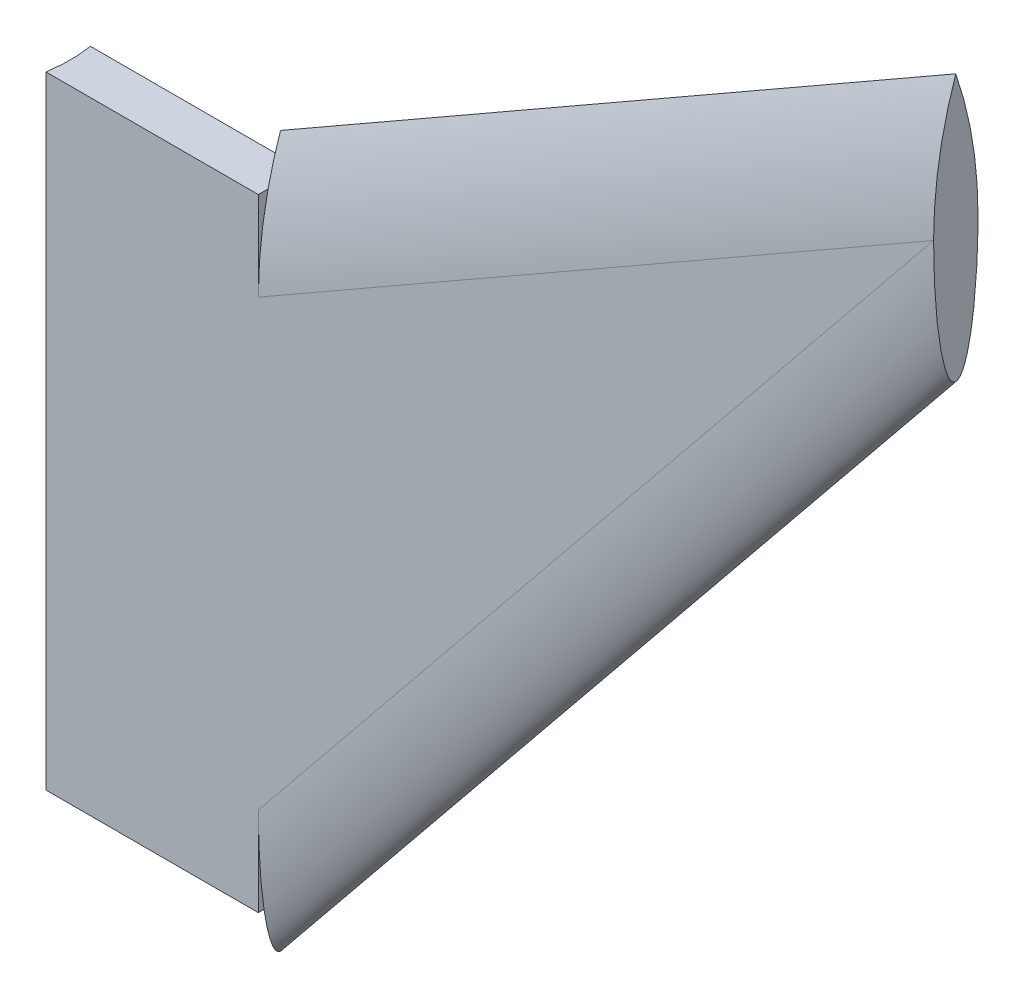
ISO-10303-21;
HEADER;
FILE_DESCRIPTION(('STEP AP214'),'2;1');
FILE_NAME('part.step','',(''),(''),'','','');
FILE_SCHEMA(('AUTOMOTIVE_DESIGN { 1 0 10303 214 1 1 1 1 }'));
ENDSEC;
DATA;
#1=APPLICATION_CONTEXT('core data for automotive mechanical design processes');
#2=APPLICATION_PROTOCOL_DEFINITION('international standard','automotive_design',2000,#1);
#3=PRODUCT_CONTEXT('',#1,'mechanical');
#4=PRODUCT('Part','Part','',(#3));
#5=PRODUCT_RELATED_PRODUCT_CATEGORY('part','',(#4));
#6=PRODUCT_DEFINITION_FORMATION('','',#4);
#7=PRODUCT_DEFINITION_CONTEXT('part definition',#1,'design');
#8=PRODUCT_DEFINITION('design','',#6,#7);
#9=PRODUCT_DEFINITION_SHAPE('','',#8);
#10=(LENGTH_UNIT() NAMED_UNIT(*) SI_UNIT(.MILLI.,.METRE.));
#11=(NAMED_UNIT(*) PLANE_ANGLE_UNIT() SI_UNIT($,.RADIAN.));
#12=(NAMED_UNIT(*) SI_UNIT($,.STERADIAN.) SOLID_ANGLE_UNIT());
#13=UNCERTAINTY_MEASURE_WITH_UNIT(LENGTH_MEASURE(1.E-05),#10,'distance_accuracy_value','');
#14=(GEOMETRIC_REPRESENTATION_CONTEXT(3) GLOBAL_UNCERTAINTY_ASSIGNED_CONTEXT((#13)) GLOBAL_UNIT_ASSIGNED_CONTEXT((#10,
#11,#12)) REPRESENTATION_CONTEXT('',''));
#15=CARTESIAN_POINT('',(0.,0.,0.));
#16=DIRECTION('',(0.,0.,1.));
#17=DIRECTION('',(1.,0.,0.));
#18=AXIS2_PLACEMENT_3D('',#15,#16,#17);
#19=CARTESIAN_POINT('',(101.,118.517979034708,5.));
#20=DIRECTION('',(-1.,0.,0.));
#21=DIRECTION('',(0.,-1.,0.));
#22=AXIS2_PLACEMENT_3D('',#19,#20,#21);
#23=PLANE('',#22);
#24=CARTESIAN_POINT('',(101.,103.517979034709,46.25));
#25=DIRECTION('',(1.,0.,0.));
#26=DIRECTION('',(0.,0.,-1.));
#27=AXIS2_PLACEMENT_3D('',#24,#25,#26);
#28=CIRCLE('',#27,46.25);
#29=CARTESIAN_POINT('',(101.,103.517979034708,0.));
#30=VERTEX_POINT('',#29);
#31=CARTESIAN_POINT('',(101.,118.517979034708,2.5));
#32=VERTEX_POINT('',#31);
#33=EDGE_CURVE('E154',#30,#32,#28,.T.);
#34=ORIENTED_EDGE('',*,*,#33,.T.);
#35=CARTESIAN_POINT('',(101.,103.517979034709,-41.2500000000003));
#36=DIRECTION('',(1.,0.,0.));
#37=DIRECTION('',(0.,0.,-1.));
#38=AXIS2_PLACEMENT_3D('',#35,#36,#37);
#39=CIRCLE('',#38,46.2500000000001);
#40=CARTESIAN_POINT('',(101.,103.517979034708,5.));
#41=VERTEX_POINT('',#40);
#42=EDGE_CURVE('E249',#41,#32,#39,.F.);
#43=ORIENTED_EDGE('',*,*,#42,.F.);
#44=CARTESIAN_POINT('',(101.,103.517979034708,2.5));
#45=DIRECTION('',(1.,0.,0.));
#46=DIRECTION('',(0.,-1.,0.));
#47=AXIS2_PLACEMENT_3D('',#44,#45,#46);
#48=ELLIPSE('',#47,15.,2.5);
#49=EDGE_CURVE('E187',#41,#30,#48,.T.);
#50=ORIENTED_EDGE('',*,*,#49,.T.);
#51=EDGE_LOOP('',(#34,#43,#50));
#52=FACE_BOUND('',#51,.T.);
#53=ADVANCED_FACE('F57',(#52),#23,.F.);
#54=CARTESIAN_POINT('',(25.,70.,5.));
#55=DIRECTION('',(1.,0.,0.));
#56=DIRECTION('',(0.,1.,0.));
#57=AXIS2_PLACEMENT_3D('',#54,#55,#56);
#58=PLANE('',#57);
#59=CARTESIAN_POINT('',(24.9999999999998,75.,2.5));
#60=CARTESIAN_POINT('',(24.9999999999998,74.5958135468942,2.36142006780214));
#61=CARTESIAN_POINT('',(24.9999999999998,74.1897057927937,2.22844436325049));
#62=CARTESIAN_POINT('',(24.9999999999998,73.3754995083999,1.9742767450913));
#63=CARTESIAN_POINT('',(24.9999999999998,72.9674142565219,1.85304229395882));
#64=CARTESIAN_POINT('',(24.9999999999998,72.1492854164186,1.6222341784096));
#65=CARTESIAN_POINT('',(24.9999999999999,71.7392514201679,1.51262651320022));
#66=CARTESIAN_POINT('',(24.9999999999999,70.9172509844841,1.30497331968858));
#67=CARTESIAN_POINT('',(24.9999999999999,70.5052909984862,1.20690224469508));
#68=CARTESIAN_POINT('',(24.9999999999999,69.6794572334645,1.02225008441754));
#69=CARTESIAN_POINT('',(24.9999999999999,69.2655872843,0.935651870302538));
#70=CARTESIAN_POINT('',(24.9999999999999,68.435945380078,0.773898513911818));
#71=CARTESIAN_POINT('',(24.9999999999999,68.0201751191739,0.698734682146799));
#72=CARTESIAN_POINT('',(24.9999999999999,67.1867312065716,0.559827363379909));
#73=CARTESIAN_POINT('',(24.9999999999999,66.7690575548736,0.496083876378038));
#74=CARTESIAN_POINT('',(24.9999999999999,65.9318006109698,0.380020758077656));
#75=CARTESIAN_POINT('',(24.9999999999999,65.5122161031286,0.327709896021407));
#76=CARTESIAN_POINT('',(24.9999999999999,64.6711348139635,0.234542880605562));
#77=CARTESIAN_POINT('',(24.9999999999999,64.2496361001829,0.193704172310695));
#78=CARTESIAN_POINT('',(24.9999999999999,63.4047211387974,0.123538133037283));
#79=CARTESIAN_POINT('',(24.9999999999999,62.9813027103802,0.0942370608539308));
#80=CARTESIAN_POINT('',(24.9999999999999,62.1325403646945,0.0472299788352955));
#81=CARTESIAN_POINT('',(24.9999999999999,61.7071944936317,0.0295592428226022));
#82=CARTESIAN_POINT('',(24.9999999999999,60.8545666187261,0.005921167723736));
#83=CARTESIAN_POINT('',(24.9999999999999,60.4272833795923,-1.62665042894894E-06));
#84=CARTESIAN_POINT('',(24.9999999999999,60.,0.));
#85=B_SPLINE_CURVE_WITH_KNOTS('',3,(#59,#60,#61,#62,#63,#64,#65,#66,#67,#68,#69,#70,#71,#72,#73,
#74,#75,#76,#77,#78,#79,#80,#81,#82,#83,#84),.UNSPECIFIED.,.F.,.F.,(4,2,2,2,2,2,2,2,2,2,2,2,4),
(0.,1.28180880434696,2.55878487996336,3.83191723178794,5.10217505462903,6.37051449783669,
7.63788520674629,8.90525591565599,10.1735953588638,11.4438531817043,12.7169855335304,
13.9939616091477,15.275770413483),.UNSPECIFIED.);
#86=CARTESIAN_POINT('',(24.9999999999998,75.,2.5));
#87=VERTEX_POINT('',#86);
#88=CARTESIAN_POINT('',(24.9999999999999,70.,1.09402032952891));
#89=VERTEX_POINT('',#88);
#90=EDGE_CURVE('E320',#87,#89,#85,.T.);
#91=ORIENTED_EDGE('',*,*,#90,.T.);
#92=DIRECTION('',(0.,0.,-1.));
#93=VECTOR('',#92,1.);
#94=CARTESIAN_POINT('',(25.,70.,5.));
#95=LINE('',#94,#93);
#96=CARTESIAN_POINT('',(24.9999999999999,70.,3.90597967047113));
#97=VERTEX_POINT('',#96);
#98=EDGE_CURVE('E171',#97,#89,#95,.T.);
#99=ORIENTED_EDGE('',*,*,#98,.F.);
#100=CARTESIAN_POINT('',(24.9999999999998,75.,2.5000000000001));
#101=CARTESIAN_POINT('',(24.9999999999998,74.5958135468942,2.63857993219796));
#102=CARTESIAN_POINT('',(24.9999999999998,74.1897057927937,2.7715556367496));
#103=CARTESIAN_POINT('',(24.9999999999998,73.3754995083999,3.02572325490877));
#104=CARTESIAN_POINT('',(24.9999999999998,72.967414256522,3.14695770604125));
#105=CARTESIAN_POINT('',(24.9999999999998,72.1492854164186,3.37776582159045));
#106=CARTESIAN_POINT('',(24.9999999999999,71.739251420168,3.48737348679984));
#107=CARTESIAN_POINT('',(24.9999999999999,70.9172509844841,3.69502668031146));
#108=CARTESIAN_POINT('',(24.9999999999999,70.5052909984863,3.79309775530496));
#109=CARTESIAN_POINT('',(24.9999999999999,69.6794572334646,3.97774991558248));
#110=CARTESIAN_POINT('',(24.9999999999999,69.2655872843,4.06434812969748));
#111=CARTESIAN_POINT('',(24.9999999999999,68.435945380078,4.22610148608819));
#112=CARTESIAN_POINT('',(24.9999999999999,68.0201751191739,4.30126531785321));
#113=CARTESIAN_POINT('',(24.9999999999999,67.1867312065717,4.44017263662009));
#114=CARTESIAN_POINT('',(24.9999999999999,66.7690575548736,4.50391612362194));
#115=CARTESIAN_POINT('',(24.9999999999999,65.9318006109698,4.61997924192231));
#116=CARTESIAN_POINT('',(24.9999999999999,65.5122161031286,4.67229010397856));
#117=CARTESIAN_POINT('',(24.9999999999999,64.6711348139635,4.7654571193944));
#118=CARTESIAN_POINT('',(24.9999999999999,64.2496361001829,4.80629582768926));
#119=CARTESIAN_POINT('',(24.9999999999999,63.4047211387974,4.87646186696266));
#120=CARTESIAN_POINT('',(24.9999999999999,62.9813027103802,4.905762939146));
#121=CARTESIAN_POINT('',(24.9999999999999,62.1325403646945,4.95277002116463));
#122=CARTESIAN_POINT('',(24.9999999999999,61.7071944936317,4.97044075717731));
#123=CARTESIAN_POINT('',(24.9999999999999,60.8545666187261,4.99407883227616));
#124=CARTESIAN_POINT('',(24.9999999999999,60.4272833795923,5.00000162665032));
#125=CARTESIAN_POINT('',(24.9999999999999,60.,4.99999999999989));
#126=B_SPLINE_CURVE_WITH_KNOTS('',3,(#100,#101,#102,#103,#104,#105,#106,#107,#108,#109,#110,
#111,#112,#113,#114,#115,#116,#117,#118,#119,#120,#121,#122,#123,#124,#125),.UNSPECIFIED.,.F.,
.F.,(4,2,2,2,2,2,2,2,2,2,2,2,4),(0.,1.28180880434696,2.55878487996336,3.83191723178793,
5.10217505462904,6.37051449783671,7.63788520674631,8.90525591565602,10.1735953588638,
11.4438531817043,12.7169855335304,13.9939616091478,15.275770413483),.UNSPECIFIED.);
#127=EDGE_CURVE('E223',#87,#97,#126,.T.);
#128=ORIENTED_EDGE('',*,*,#127,.F.);
#129=EDGE_LOOP('',(#91,#99,#128));
#130=FACE_BOUND('',#129,.T.);
#131=ADVANCED_FACE('F280',(#130),#58,.F.);
#132=CARTESIAN_POINT('',(0.,0.,0.));
#133=DIRECTION('',(0.,0.,-1.));
#134=DIRECTION('',(-1.,0.,0.));
#135=AXIS2_PLACEMENT_3D('',#132,#133,#134);
#136=PLANE('',#135);
#137=DIRECTION('',(0.,1.,0.));
#138=VECTOR('',#137,1.);
#139=CARTESIAN_POINT('',(1.10222914111242,-5.25596022674048,0.));
#140=LINE('',#139,#138);
#141=CARTESIAN_POINT('',(1.10222914111242,70.,0.));
#142=VERTEX_POINT('',#141);
#143=CARTESIAN_POINT('',(1.10222914111242,0.,0.));
#144=VERTEX_POINT('',#143);
#145=EDGE_CURVE('E136',#142,#144,#140,.F.);
#146=ORIENTED_EDGE('',*,*,#145,.F.);
#147=DIRECTION('',(-1.,0.,0.));
#148=VECTOR('',#147,1.);
#149=CARTESIAN_POINT('',(0.,70.,0.));
#150=LINE('',#149,#148);
#151=CARTESIAN_POINT('',(24.9999999999999,70.,0.));
#152=VERTEX_POINT('',#151);
#153=EDGE_CURVE('E150',#152,#142,#150,.T.);
#154=ORIENTED_EDGE('',*,*,#153,.F.);
#155=DIRECTION('',(0.,-1.,0.));
#156=VECTOR('',#155,1.);
#157=CARTESIAN_POINT('',(25.0000000000001,-51.6499735481215,0.));
#158=LINE('',#157,#156);
#159=CARTESIAN_POINT('',(24.9999999999999,60.,0.));
#160=VERTEX_POINT('',#159);
#161=EDGE_CURVE('E312',#152,#160,#158,.T.);
#162=ORIENTED_EDGE('',*,*,#161,.T.);
#163=DIRECTION('',(0.867803029916963,0.496908342923459,0.));
#164=VECTOR('',#163,1.);
#165=CARTESIAN_POINT('',(10.7982471445544,51.868005486587,0.));
#166=LINE('',#165,#164);
#167=EDGE_CURVE('E311',#160,#30,#166,.T.);
#168=ORIENTED_EDGE('',*,*,#167,.T.);
#169=DIRECTION('',(0.63067580743129,0.776046407066543,0.));
#170=VECTOR('',#169,1.);
#171=CARTESIAN_POINT('',(12.6012328743665,-5.25667952777929,0.));
#172=LINE('',#171,#170);
#173=CARTESIAN_POINT('',(25.,10.,0.));
#174=VERTEX_POINT('',#173);
#175=EDGE_CURVE('E182',#174,#30,#172,.T.);
#176=ORIENTED_EDGE('',*,*,#175,.F.);
#177=DIRECTION('',(0.,-1.,0.));
#178=VECTOR('',#177,1.);
#179=CARTESIAN_POINT('',(25.0000000000002,-108.774658562488,0.));
#180=LINE('',#179,#178);
#181=CARTESIAN_POINT('',(25.,0.,0.));
#182=VERTEX_POINT('',#181);
#183=EDGE_CURVE('E186',#174,#182,#180,.T.);
#184=ORIENTED_EDGE('',*,*,#183,.T.);
#185=DIRECTION('',(1.,0.,0.));
#186=VECTOR('',#185,1.);
#187=CARTESIAN_POINT('',(25.,0.,0.));
#188=LINE('',#187,#186);
#189=EDGE_CURVE('E152',#144,#182,#188,.T.);
#190=ORIENTED_EDGE('',*,*,#189,.F.);
#191=EDGE_LOOP('',(#146,#154,#162,#168,#176,#184,#190));
#192=FACE_BOUND('',#191,.T.);
#193=ADVANCED_FACE('F148',(#192),#136,.T.);
#194=CARTESIAN_POINT('',(0.,0.,5.));
#195=DIRECTION('',(0.,0.,-1.));
#196=DIRECTION('',(-1.,0.,0.));
#197=AXIS2_PLACEMENT_3D('',#194,#195,#196);
#198=PLANE('',#197);
#199=DIRECTION('',(-1.,0.,0.));
#200=VECTOR('',#199,1.);
#201=CARTESIAN_POINT('',(0.,70.,5.));
#202=LINE('',#201,#200);
#203=CARTESIAN_POINT('',(25.,70.,5.));
#204=VERTEX_POINT('',#203);
#205=CARTESIAN_POINT('',(1.10222914111242,70.,5.));
#206=VERTEX_POINT('',#205);
#207=EDGE_CURVE('E165',#204,#206,#202,.T.);
#208=ORIENTED_EDGE('',*,*,#207,.T.);
#209=DIRECTION('',(0.,1.,0.));
#210=VECTOR('',#209,1.);
#211=CARTESIAN_POINT('',(1.10222914111242,-5.25596022674048,5.));
#212=LINE('',#211,#210);
#213=CARTESIAN_POINT('',(1.10222914111242,0.,5.));
#214=VERTEX_POINT('',#213);
#215=EDGE_CURVE('E73',#206,#214,#212,.F.);
#216=ORIENTED_EDGE('',*,*,#215,.T.);
#217=DIRECTION('',(1.,0.,0.));
#218=VECTOR('',#217,1.);
#219=CARTESIAN_POINT('',(25.,0.,5.));
#220=LINE('',#219,#218);
#221=CARTESIAN_POINT('',(25.,0.,5.));
#222=VERTEX_POINT('',#221);
#223=EDGE_CURVE('E161',#214,#222,#220,.T.);
#224=ORIENTED_EDGE('',*,*,#223,.T.);
#225=DIRECTION('',(0.,1.,0.));
#226=VECTOR('',#225,1.);
#227=CARTESIAN_POINT('',(25.0000000000002,-108.774658562488,5.));
#228=LINE('',#227,#226);
#229=CARTESIAN_POINT('',(25.,10.,5.));
#230=VERTEX_POINT('',#229);
#231=EDGE_CURVE('E191',#222,#230,#228,.T.);
#232=ORIENTED_EDGE('',*,*,#231,.T.);
#233=DIRECTION('',(0.63067580743129,0.776046407066543,0.));
#234=VECTOR('',#233,1.);
#235=CARTESIAN_POINT('',(12.6012328743665,-5.25667952777929,5.));
#236=LINE('',#235,#234);
#237=EDGE_CURVE('E222',#230,#41,#236,.T.);
#238=ORIENTED_EDGE('',*,*,#237,.T.);
#239=DIRECTION('',(0.867803029916963,0.496908342923459,0.));
#240=VECTOR('',#239,1.);
#241=CARTESIAN_POINT('',(10.7982471445543,51.868005486587,5.));
#242=LINE('',#241,#240);
#243=CARTESIAN_POINT('',(24.9999999999999,60.,4.99999999999989));
#244=VERTEX_POINT('',#243);
#245=EDGE_CURVE('E253',#244,#41,#242,.T.);
#246=ORIENTED_EDGE('',*,*,#245,.F.);
#247=DIRECTION('',(0.,1.,0.));
#248=VECTOR('',#247,1.);
#249=CARTESIAN_POINT('',(25.0000000000001,-51.6499735481215,5.));
#250=LINE('',#249,#248);
#251=EDGE_CURVE('E247',#244,#204,#250,.T.);
#252=ORIENTED_EDGE('',*,*,#251,.T.);
#253=EDGE_LOOP('',(#208,#216,#224,#232,#238,#246,#252));
#254=FACE_BOUND('',#253,.T.);
#255=ADVANCED_FACE('F210',(#254),#198,.F.);
#256=CARTESIAN_POINT('',(25.,-5.,5.));
#257=DIRECTION('',(1.,0.,0.));
#258=DIRECTION('',(0.,1.,0.));
#259=AXIS2_PLACEMENT_3D('',#256,#257,#258);
#260=PLANE('',#259);
#261=CARTESIAN_POINT('',(25.,10.0000000000001,0.));
#262=CARTESIAN_POINT('',(25.,9.67532275035934,7.56133223554671E-06));
#263=CARTESIAN_POINT('',(25.,9.35064536499602,0.00175708495777899));
#264=CARTESIAN_POINT('',(25.,8.70132513673443,0.00879521380321717));
#265=CARTESIAN_POINT('',(25.,8.37668229430042,0.0140838617419464));
#266=CARTESIAN_POINT('',(25.,7.72735696655638,0.0282579491785811));
#267=CARTESIAN_POINT('',(25.,7.40267450903772,0.0371446826339007));
#268=CARTESIAN_POINT('',(25.,6.75343686188827,0.0586367090531587));
#269=CARTESIAN_POINT('',(25.,6.4288816717831,0.0712419880221396));
#270=CARTESIAN_POINT('',(25.,5.45543887862898,0.114859287202401));
#271=CARTESIAN_POINT('',(25.,4.80679070223077,0.151672420879383));
#272=CARTESIAN_POINT('',(25.,3.83481625123288,0.220176302364027));
#273=CARTESIAN_POINT('',(25.,3.51101131057275,0.245222975900726));
#274=CARTESIAN_POINT('',(25.,2.86381877306203,0.300207757168315));
#275=CARTESIAN_POINT('',(25.,2.54043116783826,0.330145765174599));
#276=CARTESIAN_POINT('',(25.,1.89426512340139,0.395507889620493));
#277=CARTESIAN_POINT('',(25.,1.57148658575406,0.430931025814008));
#278=CARTESIAN_POINT('',(25.,0.926667746970848,0.508125603197061));
#279=CARTESIAN_POINT('',(25.,0.604627484944687,0.549897373158213));
#280=CARTESIAN_POINT('',(25.,-0.0384997840056257,0.641032282782652));
#281=CARTESIAN_POINT('',(25.,-0.359586461907177,0.690397788580127));
#282=CARTESIAN_POINT('',(25.,-0.839994182229534,0.7715921884241));
#283=CARTESIAN_POINT('',(25.,-0.999920871315269,0.799846912813791));
#284=CARTESIAN_POINT('',(25.,-1.31926281202815,0.859103519460821));
#285=CARTESIAN_POINT('',(25.,-1.47867807697331,0.890105329569545));
#286=CARTESIAN_POINT('',(25.,-1.83705712759722,0.96355366601201));
#287=CARTESIAN_POINT('',(25.,-2.03583551366993,1.00691263368543));
#288=CARTESIAN_POINT('',(25.,-2.43195778587836,1.09995809546825));
#289=CARTESIAN_POINT('',(25.,-2.62930150142539,1.14964532943745));
#290=CARTESIAN_POINT('',(25.,-2.9602714208982,1.24060720104233));
#291=CARTESIAN_POINT('',(25.,-3.09450943635846,1.27964785434004));
#292=CARTESIAN_POINT('',(25.,-3.36134043501196,1.36281101318828));
#293=CARTESIAN_POINT('',(25.,-3.49393439722164,1.40693031583923));
#294=CARTESIAN_POINT('',(25.,-3.71628217995382,1.48743108611502));
#295=CARTESIAN_POINT('',(25.,-3.8066811093193,1.52202487044376));
#296=CARTESIAN_POINT('',(25.,-3.98591235016378,1.59551404646567));
#297=CARTESIAN_POINT('',(25.,-4.07474205461968,1.63441593518394));
#298=CARTESIAN_POINT('',(25.,-4.20674341689537,1.6974602939974));
#299=CARTESIAN_POINT('',(25.,-4.25092950683264,1.71947760958914));
#300=CARTESIAN_POINT('',(25.,-4.33836113223407,1.76529907784134));
#301=CARTESIAN_POINT('',(25.,-4.38160686598438,1.7891028489987));
#302=CARTESIAN_POINT('',(25.,-4.46672973029745,1.83881969402548));
#303=CARTESIAN_POINT('',(25.,-4.5086100807554,1.86472721268972));
#304=CARTESIAN_POINT('',(25.,-4.59058190265999,1.9192109991219));
#305=CARTESIAN_POINT('',(25.,-4.63067465402466,1.94778531060749));
#306=CARTESIAN_POINT('',(25.,-4.70168335859472,2.00322359669874));
#307=CARTESIAN_POINT('',(25.,-4.73300568035986,2.02956155957545));
#308=CARTESIAN_POINT('',(25.,-4.79307871453009,2.08521498286559));
#309=CARTESIAN_POINT('',(25.,-4.82182314227616,2.11453736670229));
#310=CARTESIAN_POINT('',(25.,-4.87569190823456,2.17722511856491));
#311=CARTESIAN_POINT('',(25.,-4.90075269281422,2.21064648009142));
#312=CARTESIAN_POINT('',(25.,-4.94415241241109,2.28159027223693));
#313=CARTESIAN_POINT('',(25.,-4.96252830298809,2.31908861990152));
#314=CARTESIAN_POINT('',(25.,-4.98365167506094,2.38109629548705));
#315=CARTESIAN_POINT('',(25.,-4.98972134299569,2.40446694324211));
#316=CARTESIAN_POINT('',(25.,-4.99789587786701,2.45188867690431));
#317=CARTESIAN_POINT('',(25.,-5.00000440540761,2.47593911371047));
#318=CARTESIAN_POINT('',(25.,-4.99999451308198,2.52996773886832));
#319=CARTESIAN_POINT('',(25.,-4.99671131692346,2.55995168760653));
#320=CARTESIAN_POINT('',(25.,-4.98414295822843,2.61865234481266));
#321=CARTESIAN_POINT('',(25.,-4.97484113691508,2.64736529894001));
#322=CARTESIAN_POINT('',(25.,-4.94886676045699,2.70905123917844));
#323=CARTESIAN_POINT('',(25.,-4.93099871513826,2.74150709556974));
#324=CARTESIAN_POINT('',(25.,-4.89044101887684,2.80320824733061));
#325=CARTESIAN_POINT('',(25.,-4.86774163800433,2.83244688046202));
#326=CARTESIAN_POINT('',(25.,-4.82056090951797,2.88644107771681));
#327=CARTESIAN_POINT('',(25.,-4.79626111585993,2.91135874969152));
#328=CARTESIAN_POINT('',(25.,-4.74564642349131,2.95907694809897));
#329=CARTESIAN_POINT('',(25.,-4.71932959235663,2.98187539675582));
#330=CARTESIAN_POINT('',(25.,-4.66518645502088,3.02573752450521));
#331=CARTESIAN_POINT('',(25.,-4.63735633035506,3.04679644206807));
#332=CARTESIAN_POINT('',(25.,-4.58063115741204,3.08738470201685));
#333=CARTESIAN_POINT('',(25.,-4.55173660929604,3.10691474965394));
#334=CARTESIAN_POINT('',(25.,-4.45344664980039,3.1702905443867));
#335=CARTESIAN_POINT('',(25.,-4.38219234062586,3.21125012979468));
#336=CARTESIAN_POINT('',(25.,-4.2369586853241,3.28823304590489));
#337=CARTESIAN_POINT('',(25.,-4.1629739607818,3.32424589284139));
#338=CARTESIAN_POINT('',(25.,-4.01321478537931,3.39252099498327));
#339=CARTESIAN_POINT('',(25.,-3.93743859513179,3.42477940848475));
#340=CARTESIAN_POINT('',(25.,-3.78439894400186,3.48644273828844));
#341=CARTESIAN_POINT('',(25.,-3.70713078916872,3.5158358746132));
#342=CARTESIAN_POINT('',(25.,-3.55182020749583,3.57215618767203));
#343=CARTESIAN_POINT('',(25.,-3.47377892469091,3.59908653737109));
#344=CARTESIAN_POINT('',(25.,-3.31705759844936,3.65092011964819));
#345=CARTESIAN_POINT('',(25.,-3.2383777642578,3.67582398894862));
#346=CARTESIAN_POINT('',(25.,-3.01832939261564,3.74286704191742));
#347=CARTESIAN_POINT('',(25.,-2.87639024039567,3.783133686798));
#348=CARTESIAN_POINT('',(25.,-2.59134112360011,3.85943797190763));
#349=CARTESIAN_POINT('',(25.,-2.44823075473301,3.89547407971653));
#350=CARTESIAN_POINT('',(25.,-2.16167586786272,3.9639766092781));
#351=CARTESIAN_POINT('',(25.,-2.01823413571379,3.99645473966051));
#352=CARTESIAN_POINT('',(25.,-1.73072748186224,4.05853581348177));
#353=CARTESIAN_POINT('',(25.,-1.58666253155399,4.08813862344933));
#354=CARTESIAN_POINT('',(25.,-1.15386717451548,4.17324699095801));
#355=CARTESIAN_POINT('',(25.,-0.864413430753736,4.22508100206858));
#356=CARTESIAN_POINT('',(25.,-0.284008926264064,4.32121687381062));
#357=CARTESIAN_POINT('',(25.,0.0069429683010837,4.36551174852651));
#358=CARTESIAN_POINT('',(25.,0.589691264996475,4.44787620611771));
#359=CARTESIAN_POINT('',(25.,0.881487579150644,4.48594641531899));
#360=CARTESIAN_POINT('',(25.,1.46572587284512,4.55680817049463));
#361=CARTESIAN_POINT('',(25.,1.75816787607839,4.58959951938967));
#362=CARTESIAN_POINT('',(25.,2.34346275220135,4.65055853367153));
#363=CARTESIAN_POINT('',(25.,2.63631551489506,4.6787272626783));
#364=CARTESIAN_POINT('',(25.,3.22239044666584,4.73093322725807));
#365=CARTESIAN_POINT('',(25.,3.51561262130694,4.7549703998343));
#366=CARTESIAN_POINT('',(25.,4.32349964848445,4.81598960541001));
#367=CARTESIAN_POINT('',(25.,4.83846184282847,4.84906982516783));
#368=CARTESIAN_POINT('',(25.,5.86894353471173,4.90501521693859));
#369=CARTESIAN_POINT('',(25.,6.38446304888823,4.92788007505827));
#370=CARTESIAN_POINT('',(25.,7.41659972320971,4.96421439215558));
#371=CARTESIAN_POINT('',(25.,7.93321737703503,4.97766985975036));
#372=CARTESIAN_POINT('',(25.,8.70823127944996,4.99108773405887));
#373=CARTESIAN_POINT('',(25.,8.96657377012626,4.99443280575569));
#374=CARTESIAN_POINT('',(25.,9.48327704593899,4.99888783705212));
#375=CARTESIAN_POINT('',(25.,9.74163783100035,4.99999780534674));
#376=CARTESIAN_POINT('',(25.,10.,5.));
#377=B_SPLINE_CURVE_WITH_KNOTS('',3,(#261,#262,#263,#264,#265,#266,#267,#268,#269,#270,#271,
#272,#273,#274,#275,#276,#277,#278,#279,#280,#281,#282,#283,#284,#285,#286,#287,#288,#289,#290,
#291,#292,#293,#294,#295,#296,#297,#298,#299,#300,#301,#302,#303,#304,#305,#306,#307,#308,#309,
#310,#311,#312,#313,#314,#315,#316,#317,#318,#319,#320,#321,#322,#323,#324,#325,#326,#327,#328,
#329,#330,#331,#332,#333,#334,#335,#336,#337,#338,#339,#340,#341,#342,#343,#344,#345,#346,#347,
#348,#349,#350,#351,#352,#353,#354,#355,#356,#357,#358,#359,#360,#361,#362,#363,#364,#365,#366,
#367,#368,#369,#370,#371,#372,#373,#374,#375,#376),.UNSPECIFIED.,.F.,.F.,(4,2,2,2,2,2,2,2,2,2,2,
2,2,2,2,2,2,2,2,2,2,2,2,2,2,2,2,2,2,2,2,2,2,2,2,2,2,2,2,2,2,2,2,2,2,2,2,2,2,2,2,2,2,2,2,2,2,4),
(0.,0.974027079733696,1.94806591662778,2.92245535270449,3.89684112165791,5.84566260813312,
6.81995136736275,7.79422026525553,8.76831525227762,9.74246070117611,10.7169103014632,
11.2041014547082,11.6912798163048,12.3015620211395,12.9119156418166,13.3312469148683,
13.7503151666711,14.0406212830225,14.331371328779,14.4794434743774,14.6274840882013,
14.7751457585396,14.9226999474174,15.045337023162,15.1682653804141,15.2931137328291,
15.4172610133488,15.4894051869995,15.5614826572803,15.6512548619144,15.7412766135366,
15.8517804827909,15.9625090402868,16.0667693143335,16.1711307545336,16.2757689937183,
16.3803586764507,16.6265806144706,16.8733165815827,17.1203028406379,17.3682651206437,
17.6159032966578,17.8634633616033,18.3059888961714,18.7486742346152,19.189856004125,
19.6310582433492,20.5130846493787,21.3959239610847,22.2786743867403,23.1614577610843,
24.0440377298885,24.9266311548237,26.47457580642,28.022568019328,29.5728571674391,
30.3479414671659,31.1230227516467),.UNSPECIFIED.);
#378=CARTESIAN_POINT('',(25.,0.,0.636610018750189));
#379=VERTEX_POINT('',#378);
#380=CARTESIAN_POINT('',(25.,0.,4.36338998124981));
#381=VERTEX_POINT('',#380);
#382=EDGE_CURVE('E297',#379,#381,#377,.T.);
#383=ORIENTED_EDGE('',*,*,#382,.T.);
#384=DIRECTION('',(0.,0.,-1.));
#385=VECTOR('',#384,1.);
#386=CARTESIAN_POINT('',(25.,0.,5.));
#387=LINE('',#386,#385);
#388=EDGE_CURVE('E66',#381,#379,#387,.T.);
#389=ORIENTED_EDGE('',*,*,#388,.T.);
#390=EDGE_LOOP('',(#383,#389));
#391=FACE_BOUND('',#390,.T.);
#392=ADVANCED_FACE('F288',(#391),#260,.F.);
#393=CARTESIAN_POINT('',(25.,0.,5.));
#394=DIRECTION('',(0.,1.,0.));
#395=DIRECTION('',(-1.,0.,0.));
#396=AXIS2_PLACEMENT_3D('',#393,#394,#395);
#397=PLANE('',#396);
#398=ORIENTED_EDGE('',*,*,#223,.F.);
#399=CARTESIAN_POINT('',(-14.6,0.,2.5));
#400=DIRECTION('',(0.,1.,0.));
#401=DIRECTION('',(-1.,0.,0.));
#402=AXIS2_PLACEMENT_3D('',#399,#400,#401);
#403=CIRCLE('',#402,15.9);
#404=EDGE_CURVE('E143',#214,#144,#403,.T.);
#405=ORIENTED_EDGE('',*,*,#404,.T.);
#406=ORIENTED_EDGE('',*,*,#189,.T.);
#407=DIRECTION('',(0.,0.,-1.));
#408=VECTOR('',#407,1.);
#409=CARTESIAN_POINT('',(25.,0.,5.));
#410=LINE('',#409,#408);
#411=EDGE_CURVE('E167',#379,#182,#410,.T.);
#412=ORIENTED_EDGE('',*,*,#411,.F.);
#413=ORIENTED_EDGE('',*,*,#388,.F.);
#414=EDGE_CURVE('E12',#222,#381,#387,.T.);
#415=ORIENTED_EDGE('',*,*,#414,.F.);
#416=EDGE_LOOP('',(#398,#405,#406,#412,#413,#415));
#417=FACE_BOUND('',#416,.T.);
#418=ADVANCED_FACE('F59',(#417),#397,.F.);
#419=CARTESIAN_POINT('',(0.,70.,5.));
#420=DIRECTION('',(0.,-1.,0.));
#421=DIRECTION('',(0.,0.,-1.));
#422=AXIS2_PLACEMENT_3D('',#419,#420,#421);
#423=PLANE('',#422);
#424=ORIENTED_EDGE('',*,*,#153,.T.);
#425=CARTESIAN_POINT('',(-14.6,70.,2.5));
#426=DIRECTION('',(0.,1.,0.));
#427=DIRECTION('',(0.,0.,1.));
#428=AXIS2_PLACEMENT_3D('',#425,#426,#427);
#429=CIRCLE('',#428,15.9);
#430=EDGE_CURVE('E133',#206,#142,#429,.T.);
#431=ORIENTED_EDGE('',*,*,#430,.F.);
#432=ORIENTED_EDGE('',*,*,#207,.F.);
#433=EDGE_CURVE('E82',#204,#97,#95,.T.);
#434=ORIENTED_EDGE('',*,*,#433,.T.);
#435=ORIENTED_EDGE('',*,*,#98,.T.);
#436=DIRECTION('',(0.,0.,1.));
#437=VECTOR('',#436,1.);
#438=CARTESIAN_POINT('',(24.9999999999999,70.,5.));
#439=LINE('',#438,#437);
#440=EDGE_CURVE('E159',#152,#89,#439,.T.);
#441=ORIENTED_EDGE('',*,*,#440,.F.);
#442=EDGE_LOOP('',(#424,#431,#432,#434,#435,#441));
#443=FACE_BOUND('',#442,.T.);
#444=ADVANCED_FACE('F157',(#443),#423,.F.);
#445=CARTESIAN_POINT('',(25.,-5.,5.));
#446=DIRECTION('',(1.,0.,0.));
#447=DIRECTION('',(0.,1.,0.));
#448=AXIS2_PLACEMENT_3D('',#445,#446,#447);
#449=PLANE('',#448);
#450=ORIENTED_EDGE('',*,*,#411,.T.);
#451=ORIENTED_EDGE('',*,*,#183,.F.);
#452=EDGE_CURVE('E181',#174,#379,#377,.T.);
#453=ORIENTED_EDGE('',*,*,#452,.T.);
#454=EDGE_LOOP('',(#450,#451,#453));
#455=FACE_BOUND('',#454,.T.);
#456=ADVANCED_FACE('F206',(#455),#449,.T.);
#457=CARTESIAN_POINT('',(12.6012328743664,-5.25667952777929,2.5));
#458=DIRECTION('',(1.,0.,0.));
#459=DIRECTION('',(0.,-1.,0.));
#460=AXIS2_PLACEMENT_3D('',#457,#458,#459);
#461=ELLIPSE('',#460,15.,2.5);
#462=DIRECTION('',(0.63067580743129,0.776046407066543,0.));
#463=VECTOR('',#462,1.);
#464=SURFACE_OF_LINEAR_EXTRUSION('',#461,#463);
#465=ORIENTED_EDGE('',*,*,#175,.T.);
#466=ORIENTED_EDGE('',*,*,#49,.F.);
#467=ORIENTED_EDGE('',*,*,#237,.F.);
#468=CARTESIAN_POINT('',(25.,-4.9999999999999,2.5));
#469=CARTESIAN_POINT('',(25.,-5.0000121058868,2.51517378754127));
#470=CARTESIAN_POINT('',(25.,-4.99917156961849,2.53033948065736));
#471=CARTESIAN_POINT('',(25.,-4.99588107994828,2.56046204755288));
#472=CARTESIAN_POINT('',(25.,-4.99343475055621,2.57541931427455));
#473=CARTESIAN_POINT('',(25.,-4.98708567056379,2.60473469093899));
#474=CARTESIAN_POINT('',(25.,-4.98321004739098,2.61909874414536));
#475=CARTESIAN_POINT('',(25.,-4.97414396113123,2.64740854232668));
#476=CARTESIAN_POINT('',(25.,-4.9689527341255,2.66135403898254));
#477=CARTESIAN_POINT('',(25.,-4.94891517396813,2.70892511787896));
#478=CARTESIAN_POINT('',(25.,-4.93110120786801,2.74131652318106));
#479=CARTESIAN_POINT('',(25.,-4.89056654791831,2.80305207536263));
#480=CARTESIAN_POINT('',(25.,-4.86780928777277,2.83237095976871));
#481=CARTESIAN_POINT('',(25.,-4.82054414088877,2.88645885984108));
#482=CARTESIAN_POINT('',(25.,-4.79622475120421,2.9113956685741));
#483=CARTESIAN_POINT('',(25.,-4.74556883366466,2.9591474540478));
#484=CARTESIAN_POINT('',(25.,-4.71923037402667,2.98196035130639));
#485=CARTESIAN_POINT('',(25.,-4.66508290274746,3.02581681290543));
#486=CARTESIAN_POINT('',(25.,-4.63727222920366,3.04685830510589));
#487=CARTESIAN_POINT('',(25.,-4.58058785371939,3.08741400497012));
#488=CARTESIAN_POINT('',(25.,-4.55171465388924,3.1069289207481));
#489=CARTESIAN_POINT('',(25.,-4.45345746991964,3.1702835333583));
#490=CARTESIAN_POINT('',(25.,-4.38221465951743,3.21123726206409));
#491=CARTESIAN_POINT('',(25.,-4.23700450992477,3.28820978574919));
#492=CARTESIAN_POINT('',(25.,-4.16303178974137,3.32421809219606));
#493=CARTESIAN_POINT('',(25.,-4.01329691405109,3.39248498776995));
#494=CARTESIAN_POINT('',(25.,-3.9375330186999,3.42473973435962));
#495=CARTESIAN_POINT('',(25.,-3.78449442058206,3.48640589826208));
#496=CARTESIAN_POINT('',(25.,-3.70721465420347,3.51580460861574));
#497=CARTESIAN_POINT('',(25.,-3.5518805437178,3.57213515948332));
#498=CARTESIAN_POINT('',(25.,-3.47382734435637,3.59907017485555));
#499=CARTESIAN_POINT('',(25.,-3.31708196039277,3.65091240947866));
#500=CARTESIAN_POINT('',(25.,-3.23838998513014,3.67582026573122));
#501=CARTESIAN_POINT('',(25.,-3.01832608371555,3.74286804975597));
#502=CARTESIAN_POINT('',(25.,-2.87638358582731,3.78313557588211));
#503=CARTESIAN_POINT('',(25.,-2.59132773438318,3.85944144869314));
#504=CARTESIAN_POINT('',(25.,-2.4482139765296,3.89547826293063));
#505=CARTESIAN_POINT('',(25.,-2.16165901149642,3.96398046715763));
#506=CARTESIAN_POINT('',(25.,-2.01822062856798,3.99645772722448));
#507=CARTESIAN_POINT('',(25.,-1.73072070614285,4.05853720578621));
#508=CARTESIAN_POINT('',(25.,-1.58665913804487,4.08813929082989));
#509=CARTESIAN_POINT('',(25.,-1.15386831795069,4.17324676599659));
#510=CARTESIAN_POINT('',(25.,-0.864415725055844,4.22508059063551));
#511=CARTESIAN_POINT('',(25.,-0.284011230654368,4.32121652341492));
#512=CARTESIAN_POINT('',(25.,0.00694181444291285,4.36551158555221));
#513=CARTESIAN_POINT('',(25.,0.589691418025538,4.44787622763688));
#514=CARTESIAN_POINT('',(25.,0.8814878855334,4.48594645527826));
#515=CARTESIAN_POINT('',(25.,1.4657264865714,4.55680824213754));
#516=CARTESIAN_POINT('',(25.,1.75816864379453,4.5895996042759));
#517=CARTESIAN_POINT('',(25.,2.34346352094837,4.65055860881151));
#518=CARTESIAN_POINT('',(25.,2.63631613018103,4.67872731967498));
#519=CARTESIAN_POINT('',(25.,3.22239075459883,4.73093325250197));
#520=CARTESIAN_POINT('',(25.,3.51561277534798,4.75497041146887));
#521=CARTESIAN_POINT('',(25.,4.32349966974627,4.81598960701599));
#522=CARTESIAN_POINT('',(25.,4.83846188539254,4.84906982790507));
#523=CARTESIAN_POINT('',(25.,5.86894357732424,4.90501521882633));
#524=CARTESIAN_POINT('',(25.,6.38446307020214,4.92788007580965));
#525=CARTESIAN_POINT('',(25.,7.41659962254269,4.96421438861074));
#526=CARTESIAN_POINT('',(25.,7.9332171756344,4.97766985449827));
#527=CARTESIAN_POINT('',(25.,8.70823102764841,4.99108773058065));
#528=CARTESIAN_POINT('',(25.,8.96657356867746,4.99443280358396));
#529=CARTESIAN_POINT('',(25.,9.48327694520849,4.99888783661802));
#530=CARTESIAN_POINT('',(25.,9.74163778063541,4.99999780534379));
#531=CARTESIAN_POINT('',(25.,10.,5.));
#532=B_SPLINE_CURVE_WITH_KNOTS('',3,(#468,#469,#470,#471,#472,#473,#474,#475,#476,#477,#478,
#479,#480,#481,#482,#483,#484,#485,#486,#487,#488,#489,#490,#491,#492,#493,#494,#495,#496,#497,
#498,#499,#500,#501,#502,#503,#504,#505,#506,#507,#508,#509,#510,#511,#512,#513,#514,#515,#516,
#517,#518,#519,#520,#521,#522,#523,#524,#525,#526,#527,#528,#529,#530,#531),.UNSPECIFIED.,.F.,
.F.,(4,2,2,2,2,2,2,2,2,2,2,2,2,2,2,2,2,2,2,2,2,2,2,2,2,2,2,2,2,2,2,4),(0.,0.0454851356458516,
0.0908679701668318,0.135430410524764,0.180018786043647,0.290212835840779,0.401251590518709,
0.505590094346968,0.610029702772141,0.714589831610975,0.819101168233613,1.06528452539048,
1.31198219511696,1.55893022926769,1.80693097718716,2.05460749684117,2.30220588525368,
2.74474179323691,3.18743750510315,3.62860890200168,4.06980076608883,4.95182367653633,
5.83466648391973,6.71741737297682,7.60020121074348,8.48278071614431,9.36537367764836,
10.9133183932168,12.4613105421521,14.0115993880875,14.7866838389045,15.5617652744799),.UNSPECIFIED.);
#533=EDGE_CURVE('E214',#381,#230,#532,.T.);
#534=ORIENTED_EDGE('',*,*,#533,.F.);
#535=ORIENTED_EDGE('',*,*,#382,.F.);
#536=ORIENTED_EDGE('',*,*,#452,.F.);
#537=EDGE_LOOP('',(#465,#466,#467,#534,#535,#536));
#538=FACE_BOUND('',#537,.T.);
#539=ADVANCED_FACE('F201',(#538),#464,.T.);
#540=CARTESIAN_POINT('',(25.,-5.,5.));
#541=DIRECTION('',(1.,0.,0.));
#542=DIRECTION('',(0.,1.,0.));
#543=AXIS2_PLACEMENT_3D('',#540,#541,#542);
#544=PLANE('',#543);
#545=ORIENTED_EDGE('',*,*,#414,.T.);
#546=ORIENTED_EDGE('',*,*,#533,.T.);
#547=ORIENTED_EDGE('',*,*,#231,.F.);
#548=EDGE_LOOP('',(#545,#546,#547));
#549=FACE_BOUND('',#548,.T.);
#550=ADVANCED_FACE('F205',(#549),#544,.T.);
#551=CARTESIAN_POINT('',(25.,-5.,5.));
#552=DIRECTION('',(1.,0.,0.));
#553=DIRECTION('',(0.,1.,0.));
#554=AXIS2_PLACEMENT_3D('',#551,#552,#553);
#555=PLANE('',#554);
#556=ORIENTED_EDGE('',*,*,#433,.F.);
#557=ORIENTED_EDGE('',*,*,#251,.F.);
#558=EDGE_CURVE('E261',#97,#244,#126,.T.);
#559=ORIENTED_EDGE('',*,*,#558,.F.);
#560=EDGE_LOOP('',(#556,#557,#559));
#561=FACE_BOUND('',#560,.T.);
#562=ADVANCED_FACE('F234',(#561),#555,.T.);
#563=CARTESIAN_POINT('',(10.7982471445544,51.8680054865876,-41.2500000000003));
#564=DIRECTION('',(1.,0.,0.));
#565=DIRECTION('',(0.,0.,-1.));
#566=AXIS2_PLACEMENT_3D('',#563,#564,#565);
#567=CIRCLE('',#566,46.2500000000001);
#568=DIRECTION('',(0.867803029916963,0.496908342923459,0.));
#569=VECTOR('',#568,1.);
#570=SURFACE_OF_LINEAR_EXTRUSION('',#567,#569);
#571=ORIENTED_EDGE('',*,*,#127,.T.);
#572=ORIENTED_EDGE('',*,*,#558,.T.);
#573=ORIENTED_EDGE('',*,*,#245,.T.);
#574=ORIENTED_EDGE('',*,*,#42,.T.);
#575=DIRECTION('',(0.867803029916963,0.496908342923459,0.));
#576=VECTOR('',#575,1.);
#577=CARTESIAN_POINT('',(10.7982471445544,66.868005486587,2.5));
#578=LINE('',#577,#576);
#579=EDGE_CURVE('E254',#87,#32,#578,.T.);
#580=ORIENTED_EDGE('',*,*,#579,.F.);
#581=EDGE_LOOP('',(#571,#572,#573,#574,#580));
#582=FACE_BOUND('',#581,.T.);
#583=ADVANCED_FACE('F236',(#582),#570,.T.);
#584=CARTESIAN_POINT('',(25.,-5.,5.));
#585=DIRECTION('',(1.,0.,0.));
#586=DIRECTION('',(0.,1.,0.));
#587=AXIS2_PLACEMENT_3D('',#584,#585,#586);
#588=PLANE('',#587);
#589=ORIENTED_EDGE('',*,*,#440,.T.);
#590=EDGE_CURVE('E316',#89,#160,#85,.T.);
#591=ORIENTED_EDGE('',*,*,#590,.T.);
#592=ORIENTED_EDGE('',*,*,#161,.F.);
#593=EDGE_LOOP('',(#589,#591,#592));
#594=FACE_BOUND('',#593,.T.);
#595=ADVANCED_FACE('F240',(#594),#588,.T.);
#596=CARTESIAN_POINT('',(10.7982471445544,51.868005486587,46.25));
#597=DIRECTION('',(1.,0.,0.));
#598=DIRECTION('',(0.,0.,-1.));
#599=AXIS2_PLACEMENT_3D('',#596,#597,#598);
#600=CIRCLE('',#599,46.25);
#601=DIRECTION('',(0.867803029916963,0.496908342923459,0.));
#602=VECTOR('',#601,1.);
#603=SURFACE_OF_LINEAR_EXTRUSION('',#600,#602);
#604=ORIENTED_EDGE('',*,*,#579,.T.);
#605=ORIENTED_EDGE('',*,*,#33,.F.);
#606=ORIENTED_EDGE('',*,*,#167,.F.);
#607=ORIENTED_EDGE('',*,*,#590,.F.);
#608=ORIENTED_EDGE('',*,*,#90,.F.);
#609=EDGE_LOOP('',(#604,#605,#606,#607,#608));
#610=FACE_BOUND('',#609,.T.);
#611=ADVANCED_FACE('F329',(#610),#603,.T.);
#612=CARTESIAN_POINT('',(-14.6,-5.25596022674048,2.5));
#613=DIRECTION('',(0.,1.,0.));
#614=DIRECTION('',(0.,0.,1.));
#615=AXIS2_PLACEMENT_3D('',#612,#613,#614);
#616=CYLINDRICAL_SURFACE('',#615,15.9);
#617=ORIENTED_EDGE('',*,*,#145,.T.);
#618=ORIENTED_EDGE('',*,*,#404,.F.);
#619=ORIENTED_EDGE('',*,*,#215,.F.);
#620=ORIENTED_EDGE('',*,*,#430,.T.);
#621=EDGE_LOOP('',(#617,#618,#619,#620));
#622=FACE_BOUND('',#621,.T.);
#623=ADVANCED_FACE('F135',(#622),#616,.F.);
#624=CLOSED_SHELL('',(#53,#131,#193,#255,#392,#418,#444,#456,#539,#550,#562,#583,#595,#611,#623));
#625=MANIFOLD_SOLID_BREP('B2',#624);
#626=ADVANCED_BREP_SHAPE_REPRESENTATION('',(#18,#625),#14);
#627=SHAPE_DEFINITION_REPRESENTATION(#9,#626);
ENDSEC;
END-ISO-10303-21;
